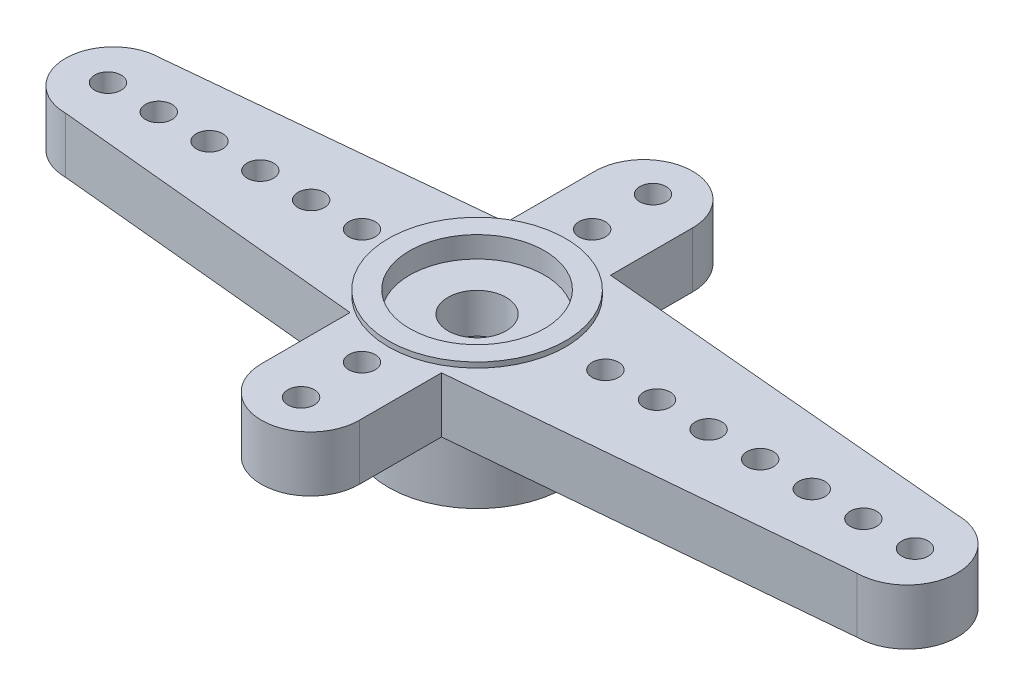
ISO-10303-21;
HEADER;
FILE_DESCRIPTION(('STEP AP214'),'2;1');
FILE_NAME('part.step','',(''),(''),'','','');
FILE_SCHEMA(('AUTOMOTIVE_DESIGN { 1 0 10303 214 1 1 1 1 }'));
ENDSEC;
DATA;
#1=APPLICATION_CONTEXT('core data for automotive mechanical design processes');
#2=APPLICATION_PROTOCOL_DEFINITION('international standard','automotive_design',2000,#1);
#3=PRODUCT_CONTEXT('',#1,'mechanical');
#4=PRODUCT('Part','Part','',(#3));
#5=PRODUCT_RELATED_PRODUCT_CATEGORY('part','',(#4));
#6=PRODUCT_DEFINITION_FORMATION('','',#4);
#7=PRODUCT_DEFINITION_CONTEXT('part definition',#1,'design');
#8=PRODUCT_DEFINITION('design','',#6,#7);
#9=PRODUCT_DEFINITION_SHAPE('','',#8);
#10=(LENGTH_UNIT() NAMED_UNIT(*) SI_UNIT(.MILLI.,.METRE.));
#11=(NAMED_UNIT(*) PLANE_ANGLE_UNIT() SI_UNIT($,.RADIAN.));
#12=(NAMED_UNIT(*) SI_UNIT($,.STERADIAN.) SOLID_ANGLE_UNIT());
#13=UNCERTAINTY_MEASURE_WITH_UNIT(LENGTH_MEASURE(1.E-05),#10,'distance_accuracy_value','');
#14=(GEOMETRIC_REPRESENTATION_CONTEXT(3) GLOBAL_UNCERTAINTY_ASSIGNED_CONTEXT((#13)) GLOBAL_UNIT_ASSIGNED_CONTEXT((#10,
#11,#12)) REPRESENTATION_CONTEXT('',''));
#15=CARTESIAN_POINT('',(0.,0.,0.));
#16=DIRECTION('',(0.,0.,1.));
#17=DIRECTION('',(1.,0.,0.));
#18=AXIS2_PLACEMENT_3D('',#15,#16,#17);
#19=CARTESIAN_POINT('',(0.,0.,0.));
#20=DIRECTION('',(0.,1.,0.));
#21=DIRECTION('',(0.,0.,1.));
#22=AXIS2_PLACEMENT_3D('',#19,#20,#21);
#23=PLANE('',#22);
#24=CARTESIAN_POINT('',(-7.4,0.,-6.65));
#25=DIRECTION('',(0.,1.,0.));
#26=DIRECTION('',(0.,0.,1.));
#27=AXIS2_PLACEMENT_3D('',#24,#25,#26);
#28=CIRCLE('',#27,0.500000000000002);
#29=CARTESIAN_POINT('',(-7.4,0.,-6.15));
#30=VERTEX_POINT('',#29);
#31=EDGE_CURVE('E521',#30,#30,#28,.F.);
#32=ORIENTED_EDGE('',*,*,#31,.F.);
#33=EDGE_LOOP('',(#32));
#34=FACE_BOUND('',#33,.T.);
#35=CARTESIAN_POINT('',(-7.4,0.,-4.35));
#36=DIRECTION('',(0.,1.,0.));
#37=DIRECTION('',(0.,0.,1.));
#38=AXIS2_PLACEMENT_3D('',#35,#36,#37);
#39=CIRCLE('',#38,0.500000000000002);
#40=CARTESIAN_POINT('',(-7.4,0.,-3.85));
#41=VERTEX_POINT('',#40);
#42=EDGE_CURVE('E513',#41,#41,#39,.F.);
#43=ORIENTED_EDGE('',*,*,#42,.F.);
#44=EDGE_LOOP('',(#43));
#45=FACE_BOUND('',#44,.T.);
#46=CARTESIAN_POINT('',(-0.599999999999998,0.,0.));
#47=DIRECTION('',(0.,1.,0.));
#48=DIRECTION('',(0.,0.,1.));
#49=AXIS2_PLACEMENT_3D('',#46,#47,#48);
#50=CIRCLE('',#49,0.5);
#51=CARTESIAN_POINT('',(-0.599999999999998,0.,0.5));
#52=VERTEX_POINT('',#51);
#53=EDGE_CURVE('E505',#52,#52,#50,.F.);
#54=ORIENTED_EDGE('',*,*,#53,.F.);
#55=EDGE_LOOP('',(#54));
#56=FACE_BOUND('',#55,.T.);
#57=CARTESIAN_POINT('',(1.35,0.,0.));
#58=DIRECTION('',(0.,1.,0.));
#59=DIRECTION('',(0.,0.,1.));
#60=AXIS2_PLACEMENT_3D('',#57,#58,#59);
#61=CIRCLE('',#60,0.5);
#62=CARTESIAN_POINT('',(1.35,0.,0.5));
#63=VERTEX_POINT('',#62);
#64=EDGE_CURVE('E497',#63,#63,#61,.F.);
#65=ORIENTED_EDGE('',*,*,#64,.F.);
#66=EDGE_LOOP('',(#65));
#67=FACE_BOUND('',#66,.T.);
#68=CARTESIAN_POINT('',(3.3,0.,0.));
#69=DIRECTION('',(0.,1.,0.));
#70=DIRECTION('',(0.,0.,1.));
#71=AXIS2_PLACEMENT_3D('',#68,#69,#70);
#72=CIRCLE('',#71,0.5);
#73=CARTESIAN_POINT('',(3.3,0.,0.5));
#74=VERTEX_POINT('',#73);
#75=EDGE_CURVE('E489',#74,#74,#72,.F.);
#76=ORIENTED_EDGE('',*,*,#75,.F.);
#77=EDGE_LOOP('',(#76));
#78=FACE_BOUND('',#77,.T.);
#79=CARTESIAN_POINT('',(5.25,0.,0.));
#80=DIRECTION('',(0.,1.,0.));
#81=DIRECTION('',(0.,0.,1.));
#82=AXIS2_PLACEMENT_3D('',#79,#80,#81);
#83=CIRCLE('',#82,0.499999999999999);
#84=CARTESIAN_POINT('',(5.25,0.,0.499999999999999));
#85=VERTEX_POINT('',#84);
#86=EDGE_CURVE('E481',#85,#85,#83,.F.);
#87=ORIENTED_EDGE('',*,*,#86,.F.);
#88=EDGE_LOOP('',(#87));
#89=FACE_BOUND('',#88,.T.);
#90=CARTESIAN_POINT('',(7.2,0.,0.));
#91=DIRECTION('',(0.,1.,0.));
#92=DIRECTION('',(0.,0.,1.));
#93=AXIS2_PLACEMENT_3D('',#90,#91,#92);
#94=CIRCLE('',#93,0.5);
#95=CARTESIAN_POINT('',(7.2,0.,0.5));
#96=VERTEX_POINT('',#95);
#97=EDGE_CURVE('E471',#96,#96,#94,.F.);
#98=ORIENTED_EDGE('',*,*,#97,.F.);
#99=EDGE_LOOP('',(#98));
#100=FACE_BOUND('',#99,.T.);
#101=CARTESIAN_POINT('',(9.15,0.,0.));
#102=DIRECTION('',(0.,1.,0.));
#103=DIRECTION('',(0.,0.,1.));
#104=AXIS2_PLACEMENT_3D('',#101,#102,#103);
#105=CIRCLE('',#104,0.499999999999999);
#106=CARTESIAN_POINT('',(9.15,0.,0.499999999999999));
#107=VERTEX_POINT('',#106);
#108=EDGE_CURVE('E472',#107,#107,#105,.F.);
#109=ORIENTED_EDGE('',*,*,#108,.F.);
#110=EDGE_LOOP('',(#109));
#111=FACE_BOUND('',#110,.T.);
#112=CARTESIAN_POINT('',(-2.55,0.,0.));
#113=DIRECTION('',(0.,1.,0.));
#114=DIRECTION('',(0.,0.,1.));
#115=AXIS2_PLACEMENT_3D('',#112,#113,#114);
#116=CIRCLE('',#115,0.5);
#117=CARTESIAN_POINT('',(-2.55,0.,0.5));
#118=VERTEX_POINT('',#117);
#119=EDGE_CURVE('E458',#118,#118,#116,.F.);
#120=ORIENTED_EDGE('',*,*,#119,.F.);
#121=EDGE_LOOP('',(#120));
#122=FACE_BOUND('',#121,.T.);
#123=CARTESIAN_POINT('',(-7.4,0.,0.));
#124=DIRECTION('',(0.,1.,0.));
#125=DIRECTION('',(0.,0.,1.));
#126=AXIS2_PLACEMENT_3D('',#123,#124,#125);
#127=CIRCLE('',#126,3.35);
#128=CARTESIAN_POINT('',(-7.4,0.,3.35));
#129=VERTEX_POINT('',#128);
#130=EDGE_CURVE('E443',#129,#129,#127,.T.);
#131=ORIENTED_EDGE('',*,*,#130,.T.);
#132=EDGE_LOOP('',(#131));
#133=FACE_BOUND('',#132,.T.);
#134=DIRECTION('',(0.,0.,-1.));
#135=VECTOR('',#134,1.);
#136=CARTESIAN_POINT('',(-9.25,0.,0.));
#137=LINE('',#136,#135);
#138=CARTESIAN_POINT('',(-9.25,0.,-2.95));
#139=VERTEX_POINT('',#138);
#140=CARTESIAN_POINT('',(-9.25,0.,-6.3));
#141=VERTEX_POINT('',#140);
#142=EDGE_CURVE('E215',#139,#141,#137,.T.);
#143=ORIENTED_EDGE('',*,*,#142,.T.);
#144=CARTESIAN_POINT('',(-7.4,0.,-6.3));
#145=DIRECTION('',(0.,1.,0.));
#146=DIRECTION('',(0.,0.,1.));
#147=AXIS2_PLACEMENT_3D('',#144,#145,#146);
#148=CIRCLE('',#147,1.85);
#149=CARTESIAN_POINT('',(-5.55,0.,-6.3));
#150=VERTEX_POINT('',#149);
#151=EDGE_CURVE('E250',#150,#141,#148,.T.);
#152=ORIENTED_EDGE('',*,*,#151,.F.);
#153=DIRECTION('',(0.,0.,-1.));
#154=VECTOR('',#153,1.);
#155=CARTESIAN_POINT('',(-5.55,0.,0.));
#156=LINE('',#155,#154);
#157=CARTESIAN_POINT('',(-5.55,0.,-3.19328623370768));
#158=VERTEX_POINT('',#157);
#159=EDGE_CURVE('E146',#158,#150,#156,.T.);
#160=ORIENTED_EDGE('',*,*,#159,.F.);
#161=DIRECTION('',(0.995991178750703,0.,0.0894515055814282));
#162=VECTOR('',#161,1.);
#163=CARTESIAN_POINT('',(0.240090440801077,0.,-2.6732692712764));
#164=LINE('',#163,#162);
#165=CARTESIAN_POINT('',(8.85,0.,-1.9));
#166=VERTEX_POINT('',#165);
#167=EDGE_CURVE('E192',#158,#166,#164,.T.);
#168=ORIENTED_EDGE('',*,*,#167,.T.);
#169=CARTESIAN_POINT('',(8.85,0.,0.));
#170=DIRECTION('',(0.,1.,0.));
#171=DIRECTION('',(0.,0.,1.));
#172=AXIS2_PLACEMENT_3D('',#169,#170,#171);
#173=CIRCLE('',#172,1.9);
#174=CARTESIAN_POINT('',(8.85,0.,1.9));
#175=VERTEX_POINT('',#174);
#176=EDGE_CURVE('E242',#175,#166,#173,.T.);
#177=ORIENTED_EDGE('',*,*,#176,.F.);
#178=DIRECTION('',(0.995991178750703,0.,-0.0894515055814282));
#179=VECTOR('',#178,1.);
#180=CARTESIAN_POINT('',(0.240090440801077,0.,2.6732692712764));
#181=LINE('',#180,#179);
#182=CARTESIAN_POINT('',(-5.55,0.,3.19328623370768));
#183=VERTEX_POINT('',#182);
#184=EDGE_CURVE('E239',#183,#175,#181,.T.);
#185=ORIENTED_EDGE('',*,*,#184,.F.);
#186=DIRECTION('',(0.,0.,-1.));
#187=VECTOR('',#186,1.);
#188=CARTESIAN_POINT('',(-5.55,0.,0.));
#189=LINE('',#188,#187);
#190=CARTESIAN_POINT('',(-5.55,0.,6.3));
#191=VERTEX_POINT('',#190);
#192=EDGE_CURVE('E236',#191,#183,#189,.T.);
#193=ORIENTED_EDGE('',*,*,#192,.F.);
#194=CARTESIAN_POINT('',(-7.4,0.,6.3));
#195=DIRECTION('',(0.,1.,0.));
#196=DIRECTION('',(0.,0.,1.));
#197=AXIS2_PLACEMENT_3D('',#194,#195,#196);
#198=CIRCLE('',#197,1.85);
#199=CARTESIAN_POINT('',(-9.25,0.,6.3));
#200=VERTEX_POINT('',#199);
#201=EDGE_CURVE('E232',#191,#200,#198,.F.);
#202=ORIENTED_EDGE('',*,*,#201,.T.);
#203=DIRECTION('',(0.,0.,-1.));
#204=VECTOR('',#203,1.);
#205=CARTESIAN_POINT('',(-9.25,0.,0.));
#206=LINE('',#205,#204);
#207=CARTESIAN_POINT('',(-9.25,0.,2.95));
#208=VERTEX_POINT('',#207);
#209=EDGE_CURVE('E228',#200,#208,#206,.T.);
#210=ORIENTED_EDGE('',*,*,#209,.T.);
#211=DIRECTION('',(0.995362939211949,0.,0.0961905361423312));
#212=VECTOR('',#211,1.);
#213=CARTESIAN_POINT('',(-0.368032987599041,0.,3.80834134993791));
#214=LINE('',#213,#212);
#215=CARTESIAN_POINT('',(-21.15,0.,1.8));
#216=VERTEX_POINT('',#215);
#217=EDGE_CURVE('E224',#216,#208,#214,.T.);
#218=ORIENTED_EDGE('',*,*,#217,.F.);
#219=CARTESIAN_POINT('',(-21.15,0.,0.));
#220=DIRECTION('',(0.,1.,0.));
#221=DIRECTION('',(0.,0.,1.));
#222=AXIS2_PLACEMENT_3D('',#219,#220,#221);
#223=CIRCLE('',#222,1.8);
#224=CARTESIAN_POINT('',(-21.15,0.,-1.8));
#225=VERTEX_POINT('',#224);
#226=EDGE_CURVE('E291',#225,#216,#223,.T.);
#227=ORIENTED_EDGE('',*,*,#226,.F.);
#228=DIRECTION('',(-0.995362939211949,0.,0.0961905361423312));
#229=VECTOR('',#228,1.);
#230=CARTESIAN_POINT('',(-0.368032987599041,0.,-3.80834134993791));
#231=LINE('',#230,#229);
#232=EDGE_CURVE('E219',#139,#225,#231,.T.);
#233=ORIENTED_EDGE('',*,*,#232,.F.);
#234=EDGE_LOOP('',(#143,#152,#160,#168,#177,#185,#193,#202,#210,#218,#227,#233));
#235=FACE_BOUND('',#234,.T.);
#236=CARTESIAN_POINT('',(-7.4,0.,4.35));
#237=DIRECTION('',(0.,1.,0.));
#238=DIRECTION('',(0.,0.,1.));
#239=AXIS2_PLACEMENT_3D('',#236,#237,#238);
#240=CIRCLE('',#239,0.500000000000002);
#241=CARTESIAN_POINT('',(-7.4,0.,4.85));
#242=VERTEX_POINT('',#241);
#243=EDGE_CURVE('E476',#242,#242,#240,.T.);
#244=ORIENTED_EDGE('',*,*,#243,.T.);
#245=EDGE_LOOP('',(#244));
#246=FACE_BOUND('',#245,.T.);
#247=CARTESIAN_POINT('',(-7.4,0.,6.65));
#248=DIRECTION('',(0.,1.,0.));
#249=DIRECTION('',(0.,0.,1.));
#250=AXIS2_PLACEMENT_3D('',#247,#248,#249);
#251=CIRCLE('',#250,0.500000000000002);
#252=CARTESIAN_POINT('',(-7.4,0.,7.15));
#253=VERTEX_POINT('',#252);
#254=EDGE_CURVE('E552',#253,#253,#251,.T.);
#255=ORIENTED_EDGE('',*,*,#254,.T.);
#256=EDGE_LOOP('',(#255));
#257=FACE_BOUND('',#256,.T.);
#258=CARTESIAN_POINT('',(-21.35,0.,0.));
#259=DIRECTION('',(0.,1.,0.));
#260=DIRECTION('',(0.,0.,1.));
#261=AXIS2_PLACEMENT_3D('',#258,#259,#260);
#262=CIRCLE('',#261,0.499999999999999);
#263=CARTESIAN_POINT('',(-21.35,0.,0.500000000000066));
#264=VERTEX_POINT('',#263);
#265=EDGE_CURVE('E544',#264,#264,#262,.T.);
#266=ORIENTED_EDGE('',*,*,#265,.T.);
#267=EDGE_LOOP('',(#266));
#268=FACE_BOUND('',#267,.T.);
#269=CARTESIAN_POINT('',(-19.43,0.,0.));
#270=DIRECTION('',(0.,1.,0.));
#271=DIRECTION('',(0.,0.,1.));
#272=AXIS2_PLACEMENT_3D('',#269,#270,#271);
#273=CIRCLE('',#272,0.500000000000003);
#274=CARTESIAN_POINT('',(-19.43,0.,0.500000000000056));
#275=VERTEX_POINT('',#274);
#276=EDGE_CURVE('E535',#275,#275,#273,.T.);
#277=ORIENTED_EDGE('',*,*,#276,.T.);
#278=EDGE_LOOP('',(#277));
#279=FACE_BOUND('',#278,.T.);
#280=CARTESIAN_POINT('',(-17.51,0.,0.));
#281=DIRECTION('',(0.,1.,0.));
#282=DIRECTION('',(0.,0.,1.));
#283=AXIS2_PLACEMENT_3D('',#280,#281,#282);
#284=CIRCLE('',#283,0.500000000000006);
#285=CARTESIAN_POINT('',(-17.51,0.,0.500000000000047));
#286=VERTEX_POINT('',#285);
#287=EDGE_CURVE('E536',#286,#286,#284,.T.);
#288=ORIENTED_EDGE('',*,*,#287,.T.);
#289=EDGE_LOOP('',(#288));
#290=FACE_BOUND('',#289,.T.);
#291=CARTESIAN_POINT('',(-15.59,0.,0.));
#292=DIRECTION('',(0.,1.,0.));
#293=DIRECTION('',(0.,0.,1.));
#294=AXIS2_PLACEMENT_3D('',#291,#292,#293);
#295=CIRCLE('',#294,0.500000000000003);
#296=CARTESIAN_POINT('',(-15.59,0.,0.500000000000029));
#297=VERTEX_POINT('',#296);
#298=EDGE_CURVE('E583',#297,#297,#295,.T.);
#299=ORIENTED_EDGE('',*,*,#298,.T.);
#300=EDGE_LOOP('',(#299));
#301=FACE_BOUND('',#300,.T.);
#302=CARTESIAN_POINT('',(-13.67,0.,0.));
#303=DIRECTION('',(0.,1.,0.));
#304=DIRECTION('',(0.,0.,1.));
#305=AXIS2_PLACEMENT_3D('',#302,#303,#304);
#306=CIRCLE('',#305,0.500000000000003);
#307=CARTESIAN_POINT('',(-13.67,0.,0.500000000000016));
#308=VERTEX_POINT('',#307);
#309=EDGE_CURVE('E575',#308,#308,#306,.T.);
#310=ORIENTED_EDGE('',*,*,#309,.T.);
#311=EDGE_LOOP('',(#310));
#312=FACE_BOUND('',#311,.T.);
#313=CARTESIAN_POINT('',(-11.75,0.,0.));
#314=DIRECTION('',(0.,1.,0.));
#315=DIRECTION('',(0.,0.,1.));
#316=AXIS2_PLACEMENT_3D('',#313,#314,#315);
#317=CIRCLE('',#316,0.500000000000003);
#318=CARTESIAN_POINT('',(-11.75,0.,0.500000000000003));
#319=VERTEX_POINT('',#318);
#320=EDGE_CURVE('E567',#319,#319,#317,.T.);
#321=ORIENTED_EDGE('',*,*,#320,.T.);
#322=EDGE_LOOP('',(#321));
#323=FACE_BOUND('',#322,.T.);
#324=ADVANCED_FACE('F86',(#34,#45,#56,#67,#78,#89,#100,#111,#122,#133,#235,#246,#257,#268,#279,
#290,#301,#312,#323),#23,.F.);
#325=CARTESIAN_POINT('',(0.,2.1,0.));
#326=DIRECTION('',(0.,1.,0.));
#327=DIRECTION('',(0.,0.,1.));
#328=AXIS2_PLACEMENT_3D('',#325,#326,#327);
#329=PLANE('',#328);
#330=CARTESIAN_POINT('',(-7.4,2.1,-6.65));
#331=DIRECTION('',(0.,1.,0.));
#332=DIRECTION('',(0.,0.,1.));
#333=AXIS2_PLACEMENT_3D('',#330,#331,#332);
#334=CIRCLE('',#333,0.500000000000002);
#335=CARTESIAN_POINT('',(-7.4,2.1,-6.15));
#336=VERTEX_POINT('',#335);
#337=EDGE_CURVE('E466',#336,#336,#334,.T.);
#338=ORIENTED_EDGE('',*,*,#337,.F.);
#339=EDGE_LOOP('',(#338));
#340=FACE_BOUND('',#339,.T.);
#341=CARTESIAN_POINT('',(-7.4,2.1,-4.35));
#342=DIRECTION('',(0.,1.,0.));
#343=DIRECTION('',(0.,0.,1.));
#344=AXIS2_PLACEMENT_3D('',#341,#342,#343);
#345=CIRCLE('',#344,0.500000000000002);
#346=CARTESIAN_POINT('',(-7.4,2.1,-3.85));
#347=VERTEX_POINT('',#346);
#348=EDGE_CURVE('E517',#347,#347,#345,.T.);
#349=ORIENTED_EDGE('',*,*,#348,.F.);
#350=EDGE_LOOP('',(#349));
#351=FACE_BOUND('',#350,.T.);
#352=CARTESIAN_POINT('',(-0.599999999999998,2.1,0.));
#353=DIRECTION('',(0.,1.,0.));
#354=DIRECTION('',(0.,0.,1.));
#355=AXIS2_PLACEMENT_3D('',#352,#353,#354);
#356=CIRCLE('',#355,0.5);
#357=CARTESIAN_POINT('',(-0.599999999999998,2.1,0.5));
#358=VERTEX_POINT('',#357);
#359=EDGE_CURVE('E509',#358,#358,#356,.T.);
#360=ORIENTED_EDGE('',*,*,#359,.F.);
#361=EDGE_LOOP('',(#360));
#362=FACE_BOUND('',#361,.T.);
#363=CARTESIAN_POINT('',(1.35,2.1,0.));
#364=DIRECTION('',(0.,1.,0.));
#365=DIRECTION('',(0.,0.,1.));
#366=AXIS2_PLACEMENT_3D('',#363,#364,#365);
#367=CIRCLE('',#366,0.5);
#368=CARTESIAN_POINT('',(1.35,2.1,0.5));
#369=VERTEX_POINT('',#368);
#370=EDGE_CURVE('E501',#369,#369,#367,.T.);
#371=ORIENTED_EDGE('',*,*,#370,.F.);
#372=EDGE_LOOP('',(#371));
#373=FACE_BOUND('',#372,.T.);
#374=CARTESIAN_POINT('',(3.3,2.1,0.));
#375=DIRECTION('',(0.,1.,0.));
#376=DIRECTION('',(0.,0.,1.));
#377=AXIS2_PLACEMENT_3D('',#374,#375,#376);
#378=CIRCLE('',#377,0.5);
#379=CARTESIAN_POINT('',(3.3,2.1,0.5));
#380=VERTEX_POINT('',#379);
#381=EDGE_CURVE('E493',#380,#380,#378,.T.);
#382=ORIENTED_EDGE('',*,*,#381,.F.);
#383=EDGE_LOOP('',(#382));
#384=FACE_BOUND('',#383,.T.);
#385=CARTESIAN_POINT('',(5.25,2.1,0.));
#386=DIRECTION('',(0.,1.,0.));
#387=DIRECTION('',(0.,0.,1.));
#388=AXIS2_PLACEMENT_3D('',#385,#386,#387);
#389=CIRCLE('',#388,0.499999999999999);
#390=CARTESIAN_POINT('',(5.25,2.1,0.499999999999999));
#391=VERTEX_POINT('',#390);
#392=EDGE_CURVE('E485',#391,#391,#389,.T.);
#393=ORIENTED_EDGE('',*,*,#392,.F.);
#394=EDGE_LOOP('',(#393));
#395=FACE_BOUND('',#394,.T.);
#396=CARTESIAN_POINT('',(7.2,2.1,0.));
#397=DIRECTION('',(0.,1.,0.));
#398=DIRECTION('',(0.,0.,1.));
#399=AXIS2_PLACEMENT_3D('',#396,#397,#398);
#400=CIRCLE('',#399,0.5);
#401=CARTESIAN_POINT('',(7.2,2.1,0.5));
#402=VERTEX_POINT('',#401);
#403=EDGE_CURVE('E477',#402,#402,#400,.T.);
#404=ORIENTED_EDGE('',*,*,#403,.F.);
#405=EDGE_LOOP('',(#404));
#406=FACE_BOUND('',#405,.T.);
#407=CARTESIAN_POINT('',(9.15,2.1,0.));
#408=DIRECTION('',(0.,1.,0.));
#409=DIRECTION('',(0.,0.,1.));
#410=AXIS2_PLACEMENT_3D('',#407,#408,#409);
#411=CIRCLE('',#410,0.499999999999999);
#412=CARTESIAN_POINT('',(9.15,2.1,0.499999999999999));
#413=VERTEX_POINT('',#412);
#414=EDGE_CURVE('E467',#413,#413,#411,.T.);
#415=ORIENTED_EDGE('',*,*,#414,.F.);
#416=EDGE_LOOP('',(#415));
#417=FACE_BOUND('',#416,.T.);
#418=CARTESIAN_POINT('',(-13.67,2.1,0.));
#419=DIRECTION('',(0.,1.,0.));
#420=DIRECTION('',(0.,0.,1.));
#421=AXIS2_PLACEMENT_3D('',#418,#419,#420);
#422=CIRCLE('',#421,0.500000000000003);
#423=CARTESIAN_POINT('',(-13.67,2.1,0.500000000000016));
#424=VERTEX_POINT('',#423);
#425=EDGE_CURVE('E571',#424,#424,#422,.F.);
#426=ORIENTED_EDGE('',*,*,#425,.T.);
#427=EDGE_LOOP('',(#426));
#428=FACE_BOUND('',#427,.T.);
#429=CARTESIAN_POINT('',(-17.51,2.1,0.));
#430=DIRECTION('',(0.,1.,0.));
#431=DIRECTION('',(0.,0.,1.));
#432=AXIS2_PLACEMENT_3D('',#429,#430,#431);
#433=CIRCLE('',#432,0.500000000000006);
#434=CARTESIAN_POINT('',(-17.51,2.1,0.500000000000047));
#435=VERTEX_POINT('',#434);
#436=EDGE_CURVE('E587',#435,#435,#433,.F.);
#437=ORIENTED_EDGE('',*,*,#436,.T.);
#438=EDGE_LOOP('',(#437));
#439=FACE_BOUND('',#438,.T.);
#440=CARTESIAN_POINT('',(-21.35,2.1,0.));
#441=DIRECTION('',(0.,1.,0.));
#442=DIRECTION('',(0.,0.,1.));
#443=AXIS2_PLACEMENT_3D('',#440,#441,#442);
#444=CIRCLE('',#443,0.499999999999999);
#445=CARTESIAN_POINT('',(-21.35,2.1,0.500000000000066));
#446=VERTEX_POINT('',#445);
#447=EDGE_CURVE('E540',#446,#446,#444,.F.);
#448=ORIENTED_EDGE('',*,*,#447,.T.);
#449=EDGE_LOOP('',(#448));
#450=FACE_BOUND('',#449,.T.);
#451=CARTESIAN_POINT('',(-7.4,2.1,4.35));
#452=DIRECTION('',(0.,1.,0.));
#453=DIRECTION('',(0.,0.,1.));
#454=AXIS2_PLACEMENT_3D('',#451,#452,#453);
#455=CIRCLE('',#454,0.500000000000002);
#456=CARTESIAN_POINT('',(-7.4,2.1,4.85));
#457=VERTEX_POINT('',#456);
#458=EDGE_CURVE('E556',#457,#457,#455,.F.);
#459=ORIENTED_EDGE('',*,*,#458,.T.);
#460=EDGE_LOOP('',(#459));
#461=FACE_BOUND('',#460,.T.);
#462=CARTESIAN_POINT('',(-2.55,2.1,0.));
#463=DIRECTION('',(0.,1.,0.));
#464=DIRECTION('',(0.,0.,1.));
#465=AXIS2_PLACEMENT_3D('',#462,#463,#464);
#466=CIRCLE('',#465,0.5);
#467=CARTESIAN_POINT('',(-2.55,2.1,0.5));
#468=VERTEX_POINT('',#467);
#469=EDGE_CURVE('E462',#468,#468,#466,.T.);
#470=ORIENTED_EDGE('',*,*,#469,.F.);
#471=EDGE_LOOP('',(#470));
#472=FACE_BOUND('',#471,.T.);
#473=CARTESIAN_POINT('',(-7.4,2.1,0.));
#474=DIRECTION('',(0.,1.,0.));
#475=DIRECTION('',(0.,0.,1.));
#476=AXIS2_PLACEMENT_3D('',#473,#474,#475);
#477=CIRCLE('',#476,3.35);
#478=CARTESIAN_POINT('',(-7.4,2.1,3.35));
#479=VERTEX_POINT('',#478);
#480=EDGE_CURVE('E306',#479,#479,#477,.T.);
#481=ORIENTED_EDGE('',*,*,#480,.F.);
#482=EDGE_LOOP('',(#481));
#483=FACE_BOUND('',#482,.T.);
#484=DIRECTION('',(0.,0.,-1.));
#485=VECTOR('',#484,1.);
#486=CARTESIAN_POINT('',(-9.25,2.1,0.));
#487=LINE('',#486,#485);
#488=CARTESIAN_POINT('',(-9.25,2.1,-2.95));
#489=VERTEX_POINT('',#488);
#490=CARTESIAN_POINT('',(-9.25,2.1,-6.3));
#491=VERTEX_POINT('',#490);
#492=EDGE_CURVE('E257',#489,#491,#487,.T.);
#493=ORIENTED_EDGE('',*,*,#492,.F.);
#494=DIRECTION('',(-0.995362939211949,0.,0.0961905361423312));
#495=VECTOR('',#494,1.);
#496=CARTESIAN_POINT('',(-0.368032987599041,2.1,-3.80834134993791));
#497=LINE('',#496,#495);
#498=CARTESIAN_POINT('',(-21.15,2.1,-1.8));
#499=VERTEX_POINT('',#498);
#500=EDGE_CURVE('E315',#489,#499,#497,.T.);
#501=ORIENTED_EDGE('',*,*,#500,.T.);
#502=CARTESIAN_POINT('',(-21.15,2.1,0.));
#503=DIRECTION('',(0.,1.,0.));
#504=DIRECTION('',(0.,0.,1.));
#505=AXIS2_PLACEMENT_3D('',#502,#503,#504);
#506=CIRCLE('',#505,1.8);
#507=CARTESIAN_POINT('',(-21.15,2.1,1.8));
#508=VERTEX_POINT('',#507);
#509=EDGE_CURVE('E220',#499,#508,#506,.T.);
#510=ORIENTED_EDGE('',*,*,#509,.T.);
#511=DIRECTION('',(0.995362939211949,0.,0.0961905361423312));
#512=VECTOR('',#511,1.);
#513=CARTESIAN_POINT('',(-0.368032987599041,2.1,3.80834134993791));
#514=LINE('',#513,#512);
#515=CARTESIAN_POINT('',(-9.25,2.1,2.95));
#516=VERTEX_POINT('',#515);
#517=EDGE_CURVE('E319',#508,#516,#514,.T.);
#518=ORIENTED_EDGE('',*,*,#517,.T.);
#519=DIRECTION('',(0.,0.,-1.));
#520=VECTOR('',#519,1.);
#521=CARTESIAN_POINT('',(-9.25,2.1,0.));
#522=LINE('',#521,#520);
#523=CARTESIAN_POINT('',(-9.25,2.1,6.3));
#524=VERTEX_POINT('',#523);
#525=EDGE_CURVE('E322',#524,#516,#522,.T.);
#526=ORIENTED_EDGE('',*,*,#525,.F.);
#527=CARTESIAN_POINT('',(-7.4,2.1,6.3));
#528=DIRECTION('',(0.,1.,0.));
#529=DIRECTION('',(0.,0.,1.));
#530=AXIS2_PLACEMENT_3D('',#527,#528,#529);
#531=CIRCLE('',#530,1.85);
#532=CARTESIAN_POINT('',(-5.55,2.1,6.3));
#533=VERTEX_POINT('',#532);
#534=EDGE_CURVE('E326',#533,#524,#531,.F.);
#535=ORIENTED_EDGE('',*,*,#534,.F.);
#536=DIRECTION('',(0.,0.,-1.));
#537=VECTOR('',#536,1.);
#538=CARTESIAN_POINT('',(-5.55,2.1,0.));
#539=LINE('',#538,#537);
#540=CARTESIAN_POINT('',(-5.55,2.1,3.19328623370768));
#541=VERTEX_POINT('',#540);
#542=EDGE_CURVE('E330',#533,#541,#539,.T.);
#543=ORIENTED_EDGE('',*,*,#542,.T.);
#544=DIRECTION('',(0.995991178750703,0.,-0.0894515055814282));
#545=VECTOR('',#544,1.);
#546=CARTESIAN_POINT('',(0.240090440801077,2.1,2.6732692712764));
#547=LINE('',#546,#545);
#548=CARTESIAN_POINT('',(8.85,2.1,1.9));
#549=VERTEX_POINT('',#548);
#550=EDGE_CURVE('E209',#541,#549,#547,.T.);
#551=ORIENTED_EDGE('',*,*,#550,.T.);
#552=CARTESIAN_POINT('',(8.85,2.1,0.));
#553=DIRECTION('',(0.,1.,0.));
#554=DIRECTION('',(0.,0.,1.));
#555=AXIS2_PLACEMENT_3D('',#552,#553,#554);
#556=CIRCLE('',#555,1.9);
#557=CARTESIAN_POINT('',(8.85,2.1,-1.9));
#558=VERTEX_POINT('',#557);
#559=EDGE_CURVE('E204',#549,#558,#556,.T.);
#560=ORIENTED_EDGE('',*,*,#559,.T.);
#561=DIRECTION('',(0.995991178750703,0.,0.0894515055814282));
#562=VECTOR('',#561,1.);
#563=CARTESIAN_POINT('',(0.240090440801077,2.1,-2.6732692712764));
#564=LINE('',#563,#562);
#565=CARTESIAN_POINT('',(-5.55,2.1,-3.19328623370768));
#566=VERTEX_POINT('',#565);
#567=EDGE_CURVE('E190',#566,#558,#564,.T.);
#568=ORIENTED_EDGE('',*,*,#567,.F.);
#569=DIRECTION('',(0.,0.,-1.));
#570=VECTOR('',#569,1.);
#571=CARTESIAN_POINT('',(-5.55,2.1,0.));
#572=LINE('',#571,#570);
#573=CARTESIAN_POINT('',(-5.55,2.1,-6.3));
#574=VERTEX_POINT('',#573);
#575=EDGE_CURVE('E197',#566,#574,#572,.T.);
#576=ORIENTED_EDGE('',*,*,#575,.T.);
#577=CARTESIAN_POINT('',(-7.4,2.1,-6.3));
#578=DIRECTION('',(0.,1.,0.));
#579=DIRECTION('',(0.,0.,1.));
#580=AXIS2_PLACEMENT_3D('',#577,#578,#579);
#581=CIRCLE('',#580,1.85);
#582=EDGE_CURVE('E106',#574,#491,#581,.T.);
#583=ORIENTED_EDGE('',*,*,#582,.T.);
#584=EDGE_LOOP('',(#493,#501,#510,#518,#526,#535,#543,#551,#560,#568,#576,#583));
#585=FACE_BOUND('',#584,.T.);
#586=CARTESIAN_POINT('',(-7.4,2.1,6.65));
#587=DIRECTION('',(0.,1.,0.));
#588=DIRECTION('',(0.,0.,1.));
#589=AXIS2_PLACEMENT_3D('',#586,#587,#588);
#590=CIRCLE('',#589,0.500000000000002);
#591=CARTESIAN_POINT('',(-7.4,2.1,7.15));
#592=VERTEX_POINT('',#591);
#593=EDGE_CURVE('E548',#592,#592,#590,.F.);
#594=ORIENTED_EDGE('',*,*,#593,.T.);
#595=EDGE_LOOP('',(#594));
#596=FACE_BOUND('',#595,.T.);
#597=CARTESIAN_POINT('',(-19.43,2.1,0.));
#598=DIRECTION('',(0.,1.,0.));
#599=DIRECTION('',(0.,0.,1.));
#600=AXIS2_PLACEMENT_3D('',#597,#598,#599);
#601=CIRCLE('',#600,0.500000000000003);
#602=CARTESIAN_POINT('',(-19.43,2.1,0.500000000000056));
#603=VERTEX_POINT('',#602);
#604=EDGE_CURVE('E531',#603,#603,#601,.F.);
#605=ORIENTED_EDGE('',*,*,#604,.T.);
#606=EDGE_LOOP('',(#605));
#607=FACE_BOUND('',#606,.T.);
#608=CARTESIAN_POINT('',(-15.59,2.1,0.));
#609=DIRECTION('',(0.,1.,0.));
#610=DIRECTION('',(0.,0.,1.));
#611=AXIS2_PLACEMENT_3D('',#608,#609,#610);
#612=CIRCLE('',#611,0.500000000000003);
#613=CARTESIAN_POINT('',(-15.59,2.1,0.500000000000029));
#614=VERTEX_POINT('',#613);
#615=EDGE_CURVE('E579',#614,#614,#612,.F.);
#616=ORIENTED_EDGE('',*,*,#615,.T.);
#617=EDGE_LOOP('',(#616));
#618=FACE_BOUND('',#617,.T.);
#619=CARTESIAN_POINT('',(-11.75,2.1,0.));
#620=DIRECTION('',(0.,1.,0.));
#621=DIRECTION('',(0.,0.,1.));
#622=AXIS2_PLACEMENT_3D('',#619,#620,#621);
#623=CIRCLE('',#622,0.500000000000003);
#624=CARTESIAN_POINT('',(-11.75,2.1,0.500000000000003));
#625=VERTEX_POINT('',#624);
#626=EDGE_CURVE('E563',#625,#625,#623,.F.);
#627=ORIENTED_EDGE('',*,*,#626,.T.);
#628=EDGE_LOOP('',(#627));
#629=FACE_BOUND('',#628,.T.);
#630=ADVANCED_FACE('F201',(#340,#351,#362,#373,#384,#395,#406,#417,#428,#439,#450,#461,#472,
#483,#585,#596,#607,#618,#629),#329,.T.);
#631=CARTESIAN_POINT('',(-7.4,0.,0.));
#632=DIRECTION('',(0.,1.,0.));
#633=DIRECTION('',(0.,0.,1.));
#634=AXIS2_PLACEMENT_3D('',#631,#632,#633);
#635=CIRCLE('',#634,1.1);
#636=CARTESIAN_POINT('',(-7.4,0.,1.1));
#637=VERTEX_POINT('',#636);
#638=EDGE_CURVE('E253',#637,#637,#635,.T.);
#639=ORIENTED_EDGE('',*,*,#638,.T.);
#640=EDGE_LOOP('',(#639));
#641=FACE_BOUND('',#640,.T.);
#642=CARTESIAN_POINT('',(-7.4,0.,0.));
#643=DIRECTION('',(0.,1.,0.));
#644=DIRECTION('',(0.,0.,1.));
#645=AXIS2_PLACEMENT_3D('',#642,#643,#644);
#646=CIRCLE('',#645,2.55);
#647=CARTESIAN_POINT('',(-7.4,0.,2.55));
#648=VERTEX_POINT('',#647);
#649=EDGE_CURVE('E12',#648,#648,#646,.T.);
#650=ORIENTED_EDGE('',*,*,#649,.F.);
#651=EDGE_LOOP('',(#650));
#652=FACE_BOUND('',#651,.T.);
#653=ADVANCED_FACE('F379',(#641,#652),#23,.F.);
#654=CARTESIAN_POINT('',(-7.4,2.1,0.));
#655=DIRECTION('',(0.,-1.,0.));
#656=DIRECTION('',(0.,0.,-1.));
#657=AXIS2_PLACEMENT_3D('',#654,#655,#656);
#658=CYLINDRICAL_SURFACE('',#657,1.1);
#659=ORIENTED_EDGE('',*,*,#638,.F.);
#660=EDGE_LOOP('',(#659));
#661=FACE_BOUND('',#660,.T.);
#662=CARTESIAN_POINT('',(-7.4,1.5,0.));
#663=DIRECTION('',(0.,1.,0.));
#664=DIRECTION('',(0.,0.,1.));
#665=AXIS2_PLACEMENT_3D('',#662,#663,#664);
#666=CIRCLE('',#665,1.1);
#667=CARTESIAN_POINT('',(-7.4,1.5,1.1));
#668=VERTEX_POINT('',#667);
#669=EDGE_CURVE('E90',#668,#668,#666,.T.);
#670=ORIENTED_EDGE('',*,*,#669,.T.);
#671=EDGE_LOOP('',(#670));
#672=FACE_BOUND('',#671,.T.);
#673=ADVANCED_FACE('F390',(#661,#672),#658,.F.);
#674=CARTESIAN_POINT('',(-0.368032987599041,2.1,-3.80834134993791));
#675=DIRECTION('',(0.0961905361423312,0.,0.99536293921195));
#676=DIRECTION('',(0.99536293921195,0.,-0.0961905361423312));
#677=AXIS2_PLACEMENT_3D('',#674,#675,#676);
#678=PLANE('',#677);
#679=ORIENTED_EDGE('',*,*,#232,.T.);
#680=DIRECTION('',(0.,-1.,0.));
#681=VECTOR('',#680,1.);
#682=CARTESIAN_POINT('',(-21.15,2.1,-1.8));
#683=LINE('',#682,#681);
#684=EDGE_CURVE('E284',#499,#225,#683,.T.);
#685=ORIENTED_EDGE('',*,*,#684,.F.);
#686=ORIENTED_EDGE('',*,*,#500,.F.);
#687=DIRECTION('',(0.,-1.,0.));
#688=VECTOR('',#687,1.);
#689=CARTESIAN_POINT('',(-9.25,2.1,-2.95));
#690=LINE('',#689,#688);
#691=EDGE_CURVE('E97',#489,#139,#690,.T.);
#692=ORIENTED_EDGE('',*,*,#691,.T.);
#693=EDGE_LOOP('',(#679,#685,#686,#692));
#694=FACE_BOUND('',#693,.T.);
#695=ADVANCED_FACE('F354',(#694),#678,.F.);
#696=CARTESIAN_POINT('',(-0.368032987599041,2.1,3.80834134993791));
#697=DIRECTION('',(0.0961905361423312,0.,-0.99536293921195));
#698=DIRECTION('',(-0.99536293921195,0.,-0.0961905361423312));
#699=AXIS2_PLACEMENT_3D('',#696,#697,#698);
#700=PLANE('',#699);
#701=ORIENTED_EDGE('',*,*,#217,.T.);
#702=DIRECTION('',(0.,-1.,0.));
#703=VECTOR('',#702,1.);
#704=CARTESIAN_POINT('',(-9.25,2.1,2.95));
#705=LINE('',#704,#703);
#706=EDGE_CURVE('E278',#516,#208,#705,.T.);
#707=ORIENTED_EDGE('',*,*,#706,.F.);
#708=ORIENTED_EDGE('',*,*,#517,.F.);
#709=DIRECTION('',(0.,-1.,0.));
#710=VECTOR('',#709,1.);
#711=CARTESIAN_POINT('',(-21.15,2.1,1.8));
#712=LINE('',#711,#710);
#713=EDGE_CURVE('E281',#508,#216,#712,.T.);
#714=ORIENTED_EDGE('',*,*,#713,.T.);
#715=EDGE_LOOP('',(#701,#707,#708,#714));
#716=FACE_BOUND('',#715,.T.);
#717=ADVANCED_FACE('F356',(#716),#700,.F.);
#718=CARTESIAN_POINT('',(-9.25,2.1,0.));
#719=DIRECTION('',(-1.,0.,0.));
#720=DIRECTION('',(0.,0.,1.));
#721=AXIS2_PLACEMENT_3D('',#718,#719,#720);
#722=PLANE('',#721);
#723=ORIENTED_EDGE('',*,*,#209,.F.);
#724=DIRECTION('',(0.,-1.,0.));
#725=VECTOR('',#724,1.);
#726=CARTESIAN_POINT('',(-9.25,2.1,6.3));
#727=LINE('',#726,#725);
#728=EDGE_CURVE('E275',#524,#200,#727,.T.);
#729=ORIENTED_EDGE('',*,*,#728,.F.);
#730=ORIENTED_EDGE('',*,*,#525,.T.);
#731=ORIENTED_EDGE('',*,*,#706,.T.);
#732=EDGE_LOOP('',(#723,#729,#730,#731));
#733=FACE_BOUND('',#732,.T.);
#734=ADVANCED_FACE('F367',(#733),#722,.T.);
#735=CARTESIAN_POINT('',(-7.4,2.1,6.3));
#736=DIRECTION('',(0.,-1.,0.));
#737=DIRECTION('',(0.,0.,-1.));
#738=AXIS2_PLACEMENT_3D('',#735,#736,#737);
#739=CYLINDRICAL_SURFACE('',#738,1.85);
#740=ORIENTED_EDGE('',*,*,#201,.F.);
#741=DIRECTION('',(0.,-1.,0.));
#742=VECTOR('',#741,1.);
#743=CARTESIAN_POINT('',(-5.55,2.1,6.3));
#744=LINE('',#743,#742);
#745=EDGE_CURVE('E272',#533,#191,#744,.T.);
#746=ORIENTED_EDGE('',*,*,#745,.F.);
#747=ORIENTED_EDGE('',*,*,#534,.T.);
#748=ORIENTED_EDGE('',*,*,#728,.T.);
#749=EDGE_LOOP('',(#740,#746,#747,#748));
#750=FACE_BOUND('',#749,.T.);
#751=ADVANCED_FACE('F362',(#750),#739,.T.);
#752=CARTESIAN_POINT('',(-5.55,2.1,0.));
#753=DIRECTION('',(-1.,0.,0.));
#754=DIRECTION('',(0.,0.,1.));
#755=AXIS2_PLACEMENT_3D('',#752,#753,#754);
#756=PLANE('',#755);
#757=ORIENTED_EDGE('',*,*,#192,.T.);
#758=DIRECTION('',(0.,-1.,0.));
#759=VECTOR('',#758,1.);
#760=CARTESIAN_POINT('',(-5.55,2.1,3.19328623370768));
#761=LINE('',#760,#759);
#762=EDGE_CURVE('E268',#541,#183,#761,.T.);
#763=ORIENTED_EDGE('',*,*,#762,.F.);
#764=ORIENTED_EDGE('',*,*,#542,.F.);
#765=ORIENTED_EDGE('',*,*,#745,.T.);
#766=EDGE_LOOP('',(#757,#763,#764,#765));
#767=FACE_BOUND('',#766,.T.);
#768=ADVANCED_FACE('F366',(#767),#756,.F.);
#769=CARTESIAN_POINT('',(0.240090440801077,2.1,2.6732692712764));
#770=DIRECTION('',(-0.0894515055814282,0.,-0.995991178750704));
#771=DIRECTION('',(-0.995991178750704,0.,0.0894515055814282));
#772=AXIS2_PLACEMENT_3D('',#769,#770,#771);
#773=PLANE('',#772);
#774=ORIENTED_EDGE('',*,*,#184,.T.);
#775=DIRECTION('',(0.,-1.,0.));
#776=VECTOR('',#775,1.);
#777=CARTESIAN_POINT('',(8.85,2.1,1.9));
#778=LINE('',#777,#776);
#779=EDGE_CURVE('E264',#549,#175,#778,.T.);
#780=ORIENTED_EDGE('',*,*,#779,.F.);
#781=ORIENTED_EDGE('',*,*,#550,.F.);
#782=ORIENTED_EDGE('',*,*,#762,.T.);
#783=EDGE_LOOP('',(#774,#780,#781,#782));
#784=FACE_BOUND('',#783,.T.);
#785=ADVANCED_FACE('F339',(#784),#773,.F.);
#786=CARTESIAN_POINT('',(8.85,2.1,0.));
#787=DIRECTION('',(0.,-1.,0.));
#788=DIRECTION('',(0.,0.,-1.));
#789=AXIS2_PLACEMENT_3D('',#786,#787,#788);
#790=CYLINDRICAL_SURFACE('',#789,1.9);
#791=ORIENTED_EDGE('',*,*,#176,.T.);
#792=DIRECTION('',(0.,-1.,0.));
#793=VECTOR('',#792,1.);
#794=CARTESIAN_POINT('',(8.85,2.1,-1.9));
#795=LINE('',#794,#793);
#796=EDGE_CURVE('E194',#558,#166,#795,.T.);
#797=ORIENTED_EDGE('',*,*,#796,.F.);
#798=ORIENTED_EDGE('',*,*,#559,.F.);
#799=ORIENTED_EDGE('',*,*,#779,.T.);
#800=EDGE_LOOP('',(#791,#797,#798,#799));
#801=FACE_BOUND('',#800,.T.);
#802=ADVANCED_FACE('F343',(#801),#790,.T.);
#803=CARTESIAN_POINT('',(0.240090440801077,2.1,-2.6732692712764));
#804=DIRECTION('',(0.0894515055814282,0.,-0.995991178750704));
#805=DIRECTION('',(-0.995991178750704,0.,-0.0894515055814282));
#806=AXIS2_PLACEMENT_3D('',#803,#804,#805);
#807=PLANE('',#806);
#808=ORIENTED_EDGE('',*,*,#167,.F.);
#809=DIRECTION('',(0.,-1.,0.));
#810=VECTOR('',#809,1.);
#811=CARTESIAN_POINT('',(-5.55,2.1,-3.19328623370768));
#812=LINE('',#811,#810);
#813=EDGE_CURVE('E186',#566,#158,#812,.T.);
#814=ORIENTED_EDGE('',*,*,#813,.F.);
#815=ORIENTED_EDGE('',*,*,#567,.T.);
#816=ORIENTED_EDGE('',*,*,#796,.T.);
#817=EDGE_LOOP('',(#808,#814,#815,#816));
#818=FACE_BOUND('',#817,.T.);
#819=ADVANCED_FACE('F188',(#818),#807,.T.);
#820=CARTESIAN_POINT('',(-5.55,2.1,0.));
#821=DIRECTION('',(-1.,0.,0.));
#822=DIRECTION('',(0.,0.,1.));
#823=AXIS2_PLACEMENT_3D('',#820,#821,#822);
#824=PLANE('',#823);
#825=ORIENTED_EDGE('',*,*,#159,.T.);
#826=DIRECTION('',(0.,-1.,0.));
#827=VECTOR('',#826,1.);
#828=CARTESIAN_POINT('',(-5.55,2.1,-6.3));
#829=LINE('',#828,#827);
#830=EDGE_CURVE('E195',#574,#150,#829,.T.);
#831=ORIENTED_EDGE('',*,*,#830,.F.);
#832=ORIENTED_EDGE('',*,*,#575,.F.);
#833=ORIENTED_EDGE('',*,*,#813,.T.);
#834=EDGE_LOOP('',(#825,#831,#832,#833));
#835=FACE_BOUND('',#834,.T.);
#836=ADVANCED_FACE('F198',(#835),#824,.F.);
#837=CARTESIAN_POINT('',(-7.4,2.1,-6.3));
#838=DIRECTION('',(0.,-1.,0.));
#839=DIRECTION('',(0.,0.,-1.));
#840=AXIS2_PLACEMENT_3D('',#837,#838,#839);
#841=CYLINDRICAL_SURFACE('',#840,1.85);
#842=ORIENTED_EDGE('',*,*,#151,.T.);
#843=DIRECTION('',(0.,-1.,0.));
#844=VECTOR('',#843,1.);
#845=CARTESIAN_POINT('',(-9.25,2.1,-6.3));
#846=LINE('',#845,#844);
#847=EDGE_CURVE('E153',#491,#141,#846,.T.);
#848=ORIENTED_EDGE('',*,*,#847,.F.);
#849=ORIENTED_EDGE('',*,*,#582,.F.);
#850=ORIENTED_EDGE('',*,*,#830,.T.);
#851=EDGE_LOOP('',(#842,#848,#849,#850));
#852=FACE_BOUND('',#851,.T.);
#853=ADVANCED_FACE('F349',(#852),#841,.T.);
#854=CARTESIAN_POINT('',(-9.25,2.1,0.));
#855=DIRECTION('',(-1.,0.,0.));
#856=DIRECTION('',(0.,0.,1.));
#857=AXIS2_PLACEMENT_3D('',#854,#855,#856);
#858=PLANE('',#857);
#859=ORIENTED_EDGE('',*,*,#142,.F.);
#860=ORIENTED_EDGE('',*,*,#691,.F.);
#861=ORIENTED_EDGE('',*,*,#492,.T.);
#862=ORIENTED_EDGE('',*,*,#847,.T.);
#863=EDGE_LOOP('',(#859,#860,#861,#862));
#864=FACE_BOUND('',#863,.T.);
#865=ADVANCED_FACE('F350',(#864),#858,.T.);
#866=CARTESIAN_POINT('',(-21.15,2.1,0.));
#867=DIRECTION('',(0.,-1.,0.));
#868=DIRECTION('',(0.,0.,-1.));
#869=AXIS2_PLACEMENT_3D('',#866,#867,#868);
#870=CYLINDRICAL_SURFACE('',#869,1.8);
#871=ORIENTED_EDGE('',*,*,#509,.F.);
#872=ORIENTED_EDGE('',*,*,#684,.T.);
#873=ORIENTED_EDGE('',*,*,#226,.T.);
#874=ORIENTED_EDGE('',*,*,#713,.F.);
#875=EDGE_LOOP('',(#871,#872,#873,#874));
#876=FACE_BOUND('',#875,.T.);
#877=ADVANCED_FACE('F88',(#876),#870,.T.);
#878=CARTESIAN_POINT('',(-7.4,2.3,0.));
#879=DIRECTION('',(0.,-1.,0.));
#880=DIRECTION('',(0.,0.,-1.));
#881=AXIS2_PLACEMENT_3D('',#878,#879,#880);
#882=CYLINDRICAL_SURFACE('',#881,2.55);
#883=CARTESIAN_POINT('',(-7.4,2.3,0.));
#884=DIRECTION('',(0.,1.,0.));
#885=DIRECTION('',(0.,0.,1.));
#886=AXIS2_PLACEMENT_3D('',#883,#884,#885);
#887=CIRCLE('',#886,2.55);
#888=CARTESIAN_POINT('',(-7.4,2.3,2.55));
#889=VERTEX_POINT('',#888);
#890=EDGE_CURVE('E300',#889,#889,#887,.T.);
#891=ORIENTED_EDGE('',*,*,#890,.T.);
#892=EDGE_LOOP('',(#891));
#893=FACE_BOUND('',#892,.T.);
#894=CARTESIAN_POINT('',(-7.4,1.5,0.));
#895=DIRECTION('',(0.,1.,0.));
#896=DIRECTION('',(0.,0.,1.));
#897=AXIS2_PLACEMENT_3D('',#894,#895,#896);
#898=CIRCLE('',#897,2.55);
#899=CARTESIAN_POINT('',(-7.4,1.5,2.55));
#900=VERTEX_POINT('',#899);
#901=EDGE_CURVE('E440',#900,#900,#898,.T.);
#902=ORIENTED_EDGE('',*,*,#901,.F.);
#903=EDGE_LOOP('',(#902));
#904=FACE_BOUND('',#903,.T.);
#905=ADVANCED_FACE('F429',(#893,#904),#882,.F.);
#906=CARTESIAN_POINT('',(-7.4,2.3,0.));
#907=DIRECTION('',(0.,-1.,0.));
#908=DIRECTION('',(0.,0.,-1.));
#909=AXIS2_PLACEMENT_3D('',#906,#907,#908);
#910=CYLINDRICAL_SURFACE('',#909,3.35);
#911=CARTESIAN_POINT('',(-7.4,2.3,0.));
#912=DIRECTION('',(0.,1.,0.));
#913=DIRECTION('',(0.,0.,1.));
#914=AXIS2_PLACEMENT_3D('',#911,#912,#913);
#915=CIRCLE('',#914,3.35);
#916=CARTESIAN_POINT('',(-7.4,2.3,3.35));
#917=VERTEX_POINT('',#916);
#918=EDGE_CURVE('E294',#917,#917,#915,.T.);
#919=ORIENTED_EDGE('',*,*,#918,.F.);
#920=EDGE_LOOP('',(#919));
#921=FACE_BOUND('',#920,.T.);
#922=ORIENTED_EDGE('',*,*,#480,.T.);
#923=EDGE_LOOP('',(#922));
#924=FACE_BOUND('',#923,.T.);
#925=ADVANCED_FACE('F425',(#921,#924),#910,.T.);
#926=CARTESIAN_POINT('',(0.,2.3,0.));
#927=DIRECTION('',(0.,1.,0.));
#928=DIRECTION('',(0.,0.,1.));
#929=AXIS2_PLACEMENT_3D('',#926,#927,#928);
#930=PLANE('',#929);
#931=ORIENTED_EDGE('',*,*,#890,.F.);
#932=EDGE_LOOP('',(#931));
#933=FACE_BOUND('',#932,.T.);
#934=ORIENTED_EDGE('',*,*,#918,.T.);
#935=EDGE_LOOP('',(#934));
#936=FACE_BOUND('',#935,.T.);
#937=ADVANCED_FACE('F421',(#933,#936),#930,.T.);
#938=CARTESIAN_POINT('',(-7.4,1.5,0.));
#939=DIRECTION('',(0.,1.,0.));
#940=DIRECTION('',(0.,0.,1.));
#941=AXIS2_PLACEMENT_3D('',#938,#939,#940);
#942=PLANE('',#941);
#943=ORIENTED_EDGE('',*,*,#669,.F.);
#944=EDGE_LOOP('',(#943));
#945=FACE_BOUND('',#944,.T.);
#946=ORIENTED_EDGE('',*,*,#901,.T.);
#947=EDGE_LOOP('',(#946));
#948=FACE_BOUND('',#947,.T.);
#949=ADVANCED_FACE('F413',(#945,#948),#942,.T.);
#950=CARTESIAN_POINT('',(-7.4,-2.5,0.));
#951=DIRECTION('',(0.,1.,0.));
#952=DIRECTION('',(0.,0.,1.));
#953=AXIS2_PLACEMENT_3D('',#950,#951,#952);
#954=CYLINDRICAL_SURFACE('',#953,3.35);
#955=CARTESIAN_POINT('',(-7.4,-2.5,0.));
#956=DIRECTION('',(0.,1.,0.));
#957=DIRECTION('',(0.,0.,1.));
#958=AXIS2_PLACEMENT_3D('',#955,#956,#957);
#959=CIRCLE('',#958,3.35);
#960=CARTESIAN_POINT('',(-7.4,-2.5,3.35));
#961=VERTEX_POINT('',#960);
#962=EDGE_CURVE('E448',#961,#961,#959,.T.);
#963=ORIENTED_EDGE('',*,*,#962,.T.);
#964=EDGE_LOOP('',(#963));
#965=FACE_BOUND('',#964,.T.);
#966=ORIENTED_EDGE('',*,*,#130,.F.);
#967=EDGE_LOOP('',(#966));
#968=FACE_BOUND('',#967,.T.);
#969=ADVANCED_FACE('F405',(#965,#968),#954,.T.);
#970=CARTESIAN_POINT('',(-7.4,-2.5,0.));
#971=DIRECTION('',(0.,1.,0.));
#972=DIRECTION('',(0.,0.,1.));
#973=AXIS2_PLACEMENT_3D('',#970,#971,#972);
#974=CYLINDRICAL_SURFACE('',#973,2.55);
#975=CARTESIAN_POINT('',(-7.4,-2.5,0.));
#976=DIRECTION('',(0.,1.,0.));
#977=DIRECTION('',(0.,0.,1.));
#978=AXIS2_PLACEMENT_3D('',#975,#976,#977);
#979=CIRCLE('',#978,2.55);
#980=CARTESIAN_POINT('',(-7.4,-2.5,2.55));
#981=VERTEX_POINT('',#980);
#982=EDGE_CURVE('E454',#981,#981,#979,.T.);
#983=ORIENTED_EDGE('',*,*,#982,.F.);
#984=EDGE_LOOP('',(#983));
#985=FACE_BOUND('',#984,.T.);
#986=ORIENTED_EDGE('',*,*,#649,.T.);
#987=EDGE_LOOP('',(#986));
#988=FACE_BOUND('',#987,.T.);
#989=ADVANCED_FACE('F402',(#985,#988),#974,.F.);
#990=CARTESIAN_POINT('',(-7.4,-2.5,0.));
#991=DIRECTION('',(0.,1.,0.));
#992=DIRECTION('',(0.,0.,1.));
#993=AXIS2_PLACEMENT_3D('',#990,#991,#992);
#994=PLANE('',#993);
#995=ORIENTED_EDGE('',*,*,#982,.T.);
#996=EDGE_LOOP('',(#995));
#997=FACE_BOUND('',#996,.T.);
#998=ORIENTED_EDGE('',*,*,#962,.F.);
#999=EDGE_LOOP('',(#998));
#1000=FACE_BOUND('',#999,.T.);
#1001=ADVANCED_FACE('F404',(#997,#1000),#994,.F.);
#1002=CARTESIAN_POINT('',(-2.55,-2.501,0.));
#1003=DIRECTION('',(0.,1.,0.));
#1004=DIRECTION('',(0.,0.,1.));
#1005=AXIS2_PLACEMENT_3D('',#1002,#1003,#1004);
#1006=CYLINDRICAL_SURFACE('',#1005,0.5);
#1007=ORIENTED_EDGE('',*,*,#469,.T.);
#1008=EDGE_LOOP('',(#1007));
#1009=FACE_BOUND('',#1008,.T.);
#1010=ORIENTED_EDGE('',*,*,#119,.T.);
#1011=EDGE_LOOP('',(#1010));
#1012=FACE_BOUND('',#1011,.T.);
#1013=ADVANCED_FACE('F410',(#1009,#1012),#1006,.F.);
#1014=CARTESIAN_POINT('',(-7.4,-2.501,4.35));
#1015=DIRECTION('',(0.,1.,0.));
#1016=DIRECTION('',(0.,0.,1.));
#1017=AXIS2_PLACEMENT_3D('',#1014,#1015,#1016);
#1018=CYLINDRICAL_SURFACE('',#1017,0.500000000000002);
#1019=ORIENTED_EDGE('',*,*,#458,.F.);
#1020=EDGE_LOOP('',(#1019));
#1021=FACE_BOUND('',#1020,.T.);
#1022=ORIENTED_EDGE('',*,*,#243,.F.);
#1023=EDGE_LOOP('',(#1022));
#1024=FACE_BOUND('',#1023,.T.);
#1025=ADVANCED_FACE('F623',(#1021,#1024),#1018,.F.);
#1026=CARTESIAN_POINT('',(-7.4,-2.501,6.65));
#1027=DIRECTION('',(0.,1.,0.));
#1028=DIRECTION('',(0.,0.,1.));
#1029=AXIS2_PLACEMENT_3D('',#1026,#1027,#1028);
#1030=CYLINDRICAL_SURFACE('',#1029,0.500000000000002);
#1031=ORIENTED_EDGE('',*,*,#593,.F.);
#1032=EDGE_LOOP('',(#1031));
#1033=FACE_BOUND('',#1032,.T.);
#1034=ORIENTED_EDGE('',*,*,#254,.F.);
#1035=EDGE_LOOP('',(#1034));
#1036=FACE_BOUND('',#1035,.T.);
#1037=ADVANCED_FACE('F626',(#1033,#1036),#1030,.F.);
#1038=CARTESIAN_POINT('',(-21.35,-2.501,0.));
#1039=DIRECTION('',(0.,1.,0.));
#1040=DIRECTION('',(0.,0.,1.));
#1041=AXIS2_PLACEMENT_3D('',#1038,#1039,#1040);
#1042=CYLINDRICAL_SURFACE('',#1041,0.499999999999999);
#1043=ORIENTED_EDGE('',*,*,#447,.F.);
#1044=EDGE_LOOP('',(#1043));
#1045=FACE_BOUND('',#1044,.T.);
#1046=ORIENTED_EDGE('',*,*,#265,.F.);
#1047=EDGE_LOOP('',(#1046));
#1048=FACE_BOUND('',#1047,.T.);
#1049=ADVANCED_FACE('F610',(#1045,#1048),#1042,.F.);
#1050=CARTESIAN_POINT('',(-19.43,-2.501,0.));
#1051=DIRECTION('',(0.,1.,0.));
#1052=DIRECTION('',(0.,0.,1.));
#1053=AXIS2_PLACEMENT_3D('',#1050,#1051,#1052);
#1054=CYLINDRICAL_SURFACE('',#1053,0.500000000000003);
#1055=ORIENTED_EDGE('',*,*,#604,.F.);
#1056=EDGE_LOOP('',(#1055));
#1057=FACE_BOUND('',#1056,.T.);
#1058=ORIENTED_EDGE('',*,*,#276,.F.);
#1059=EDGE_LOOP('',(#1058));
#1060=FACE_BOUND('',#1059,.T.);
#1061=ADVANCED_FACE('F600',(#1057,#1060),#1054,.F.);
#1062=CARTESIAN_POINT('',(-17.51,-2.501,0.));
#1063=DIRECTION('',(0.,1.,0.));
#1064=DIRECTION('',(0.,0.,1.));
#1065=AXIS2_PLACEMENT_3D('',#1062,#1063,#1064);
#1066=CYLINDRICAL_SURFACE('',#1065,0.500000000000006);
#1067=ORIENTED_EDGE('',*,*,#436,.F.);
#1068=EDGE_LOOP('',(#1067));
#1069=FACE_BOUND('',#1068,.T.);
#1070=ORIENTED_EDGE('',*,*,#287,.F.);
#1071=EDGE_LOOP('',(#1070));
#1072=FACE_BOUND('',#1071,.T.);
#1073=ADVANCED_FACE('F597',(#1069,#1072),#1066,.F.);
#1074=CARTESIAN_POINT('',(-15.59,-2.501,0.));
#1075=DIRECTION('',(0.,1.,0.));
#1076=DIRECTION('',(0.,0.,1.));
#1077=AXIS2_PLACEMENT_3D('',#1074,#1075,#1076);
#1078=CYLINDRICAL_SURFACE('',#1077,0.500000000000003);
#1079=ORIENTED_EDGE('',*,*,#615,.F.);
#1080=EDGE_LOOP('',(#1079));
#1081=FACE_BOUND('',#1080,.T.);
#1082=ORIENTED_EDGE('',*,*,#298,.F.);
#1083=EDGE_LOOP('',(#1082));
#1084=FACE_BOUND('',#1083,.T.);
#1085=ADVANCED_FACE('F599',(#1081,#1084),#1078,.F.);
#1086=CARTESIAN_POINT('',(-13.67,-2.501,0.));
#1087=DIRECTION('',(0.,1.,0.));
#1088=DIRECTION('',(0.,0.,1.));
#1089=AXIS2_PLACEMENT_3D('',#1086,#1087,#1088);
#1090=CYLINDRICAL_SURFACE('',#1089,0.500000000000003);
#1091=ORIENTED_EDGE('',*,*,#425,.F.);
#1092=EDGE_LOOP('',(#1091));
#1093=FACE_BOUND('',#1092,.T.);
#1094=ORIENTED_EDGE('',*,*,#309,.F.);
#1095=EDGE_LOOP('',(#1094));
#1096=FACE_BOUND('',#1095,.T.);
#1097=ADVANCED_FACE('F607',(#1093,#1096),#1090,.F.);
#1098=CARTESIAN_POINT('',(-11.75,-2.501,0.));
#1099=DIRECTION('',(0.,1.,0.));
#1100=DIRECTION('',(0.,0.,1.));
#1101=AXIS2_PLACEMENT_3D('',#1098,#1099,#1100);
#1102=CYLINDRICAL_SURFACE('',#1101,0.500000000000003);
#1103=ORIENTED_EDGE('',*,*,#626,.F.);
#1104=EDGE_LOOP('',(#1103));
#1105=FACE_BOUND('',#1104,.T.);
#1106=ORIENTED_EDGE('',*,*,#320,.F.);
#1107=EDGE_LOOP('',(#1106));
#1108=FACE_BOUND('',#1107,.T.);
#1109=ADVANCED_FACE('F617',(#1105,#1108),#1102,.F.);
#1110=CARTESIAN_POINT('',(9.15,-2.501,0.));
#1111=DIRECTION('',(0.,1.,0.));
#1112=DIRECTION('',(0.,0.,1.));
#1113=AXIS2_PLACEMENT_3D('',#1110,#1111,#1112);
#1114=CYLINDRICAL_SURFACE('',#1113,0.499999999999999);
#1115=ORIENTED_EDGE('',*,*,#414,.T.);
#1116=EDGE_LOOP('',(#1115));
#1117=FACE_BOUND('',#1116,.T.);
#1118=ORIENTED_EDGE('',*,*,#108,.T.);
#1119=EDGE_LOOP('',(#1118));
#1120=FACE_BOUND('',#1119,.T.);
#1121=ADVANCED_FACE('F621',(#1117,#1120),#1114,.F.);
#1122=CARTESIAN_POINT('',(7.2,-2.501,0.));
#1123=DIRECTION('',(0.,1.,0.));
#1124=DIRECTION('',(0.,0.,1.));
#1125=AXIS2_PLACEMENT_3D('',#1122,#1123,#1124);
#1126=CYLINDRICAL_SURFACE('',#1125,0.5);
#1127=ORIENTED_EDGE('',*,*,#403,.T.);
#1128=EDGE_LOOP('',(#1127));
#1129=FACE_BOUND('',#1128,.T.);
#1130=ORIENTED_EDGE('',*,*,#97,.T.);
#1131=EDGE_LOOP('',(#1130));
#1132=FACE_BOUND('',#1131,.T.);
#1133=ADVANCED_FACE('F657',(#1129,#1132),#1126,.F.);
#1134=CARTESIAN_POINT('',(5.25,-2.501,0.));
#1135=DIRECTION('',(0.,1.,0.));
#1136=DIRECTION('',(0.,0.,1.));
#1137=AXIS2_PLACEMENT_3D('',#1134,#1135,#1136);
#1138=CYLINDRICAL_SURFACE('',#1137,0.499999999999999);
#1139=ORIENTED_EDGE('',*,*,#392,.T.);
#1140=EDGE_LOOP('',(#1139));
#1141=FACE_BOUND('',#1140,.T.);
#1142=ORIENTED_EDGE('',*,*,#86,.T.);
#1143=EDGE_LOOP('',(#1142));
#1144=FACE_BOUND('',#1143,.T.);
#1145=ADVANCED_FACE('F653',(#1141,#1144),#1138,.F.);
#1146=CARTESIAN_POINT('',(3.3,-2.501,0.));
#1147=DIRECTION('',(0.,1.,0.));
#1148=DIRECTION('',(0.,0.,1.));
#1149=AXIS2_PLACEMENT_3D('',#1146,#1147,#1148);
#1150=CYLINDRICAL_SURFACE('',#1149,0.5);
#1151=ORIENTED_EDGE('',*,*,#381,.T.);
#1152=EDGE_LOOP('',(#1151));
#1153=FACE_BOUND('',#1152,.T.);
#1154=ORIENTED_EDGE('',*,*,#75,.T.);
#1155=EDGE_LOOP('',(#1154));
#1156=FACE_BOUND('',#1155,.T.);
#1157=ADVANCED_FACE('F649',(#1153,#1156),#1150,.F.);
#1158=CARTESIAN_POINT('',(1.35,-2.501,0.));
#1159=DIRECTION('',(0.,1.,0.));
#1160=DIRECTION('',(0.,0.,1.));
#1161=AXIS2_PLACEMENT_3D('',#1158,#1159,#1160);
#1162=CYLINDRICAL_SURFACE('',#1161,0.5);
#1163=ORIENTED_EDGE('',*,*,#370,.T.);
#1164=EDGE_LOOP('',(#1163));
#1165=FACE_BOUND('',#1164,.T.);
#1166=ORIENTED_EDGE('',*,*,#64,.T.);
#1167=EDGE_LOOP('',(#1166));
#1168=FACE_BOUND('',#1167,.T.);
#1169=ADVANCED_FACE('F645',(#1165,#1168),#1162,.F.);
#1170=CARTESIAN_POINT('',(-0.599999999999998,-2.501,0.));
#1171=DIRECTION('',(0.,1.,0.));
#1172=DIRECTION('',(0.,0.,1.));
#1173=AXIS2_PLACEMENT_3D('',#1170,#1171,#1172);
#1174=CYLINDRICAL_SURFACE('',#1173,0.5);
#1175=ORIENTED_EDGE('',*,*,#359,.T.);
#1176=EDGE_LOOP('',(#1175));
#1177=FACE_BOUND('',#1176,.T.);
#1178=ORIENTED_EDGE('',*,*,#53,.T.);
#1179=EDGE_LOOP('',(#1178));
#1180=FACE_BOUND('',#1179,.T.);
#1181=ADVANCED_FACE('F641',(#1177,#1180),#1174,.F.);
#1182=CARTESIAN_POINT('',(-7.4,-2.501,-4.35));
#1183=DIRECTION('',(0.,1.,0.));
#1184=DIRECTION('',(0.,0.,1.));
#1185=AXIS2_PLACEMENT_3D('',#1182,#1183,#1184);
#1186=CYLINDRICAL_SURFACE('',#1185,0.500000000000002);
#1187=ORIENTED_EDGE('',*,*,#348,.T.);
#1188=EDGE_LOOP('',(#1187));
#1189=FACE_BOUND('',#1188,.T.);
#1190=ORIENTED_EDGE('',*,*,#42,.T.);
#1191=EDGE_LOOP('',(#1190));
#1192=FACE_BOUND('',#1191,.T.);
#1193=ADVANCED_FACE('F637',(#1189,#1192),#1186,.F.);
#1194=CARTESIAN_POINT('',(-7.4,-2.501,-6.65));
#1195=DIRECTION('',(0.,1.,0.));
#1196=DIRECTION('',(0.,0.,1.));
#1197=AXIS2_PLACEMENT_3D('',#1194,#1195,#1196);
#1198=CYLINDRICAL_SURFACE('',#1197,0.500000000000002);
#1199=ORIENTED_EDGE('',*,*,#337,.T.);
#1200=EDGE_LOOP('',(#1199));
#1201=FACE_BOUND('',#1200,.T.);
#1202=ORIENTED_EDGE('',*,*,#31,.T.);
#1203=EDGE_LOOP('',(#1202));
#1204=FACE_BOUND('',#1203,.T.);
#1205=ADVANCED_FACE('F634',(#1201,#1204),#1198,.F.);
#1206=CLOSED_SHELL('',(#324,#630,#653,#673,#695,#717,#734,#751,#768,#785,#802,#819,#836,#853,
#865,#877,#905,#925,#937,#949,#969,#989,#1001,#1013,#1025,#1037,#1049,#1061,#1073,#1085,#1097,
#1109,#1121,#1133,#1145,#1157,#1169,#1181,#1193,#1205));
#1207=MANIFOLD_SOLID_BREP('B2',#1206);
#1208=ADVANCED_BREP_SHAPE_REPRESENTATION('',(#18,#1207),#14);
#1209=SHAPE_DEFINITION_REPRESENTATION(#9,#1208);
ENDSEC;
END-ISO-10303-21;
